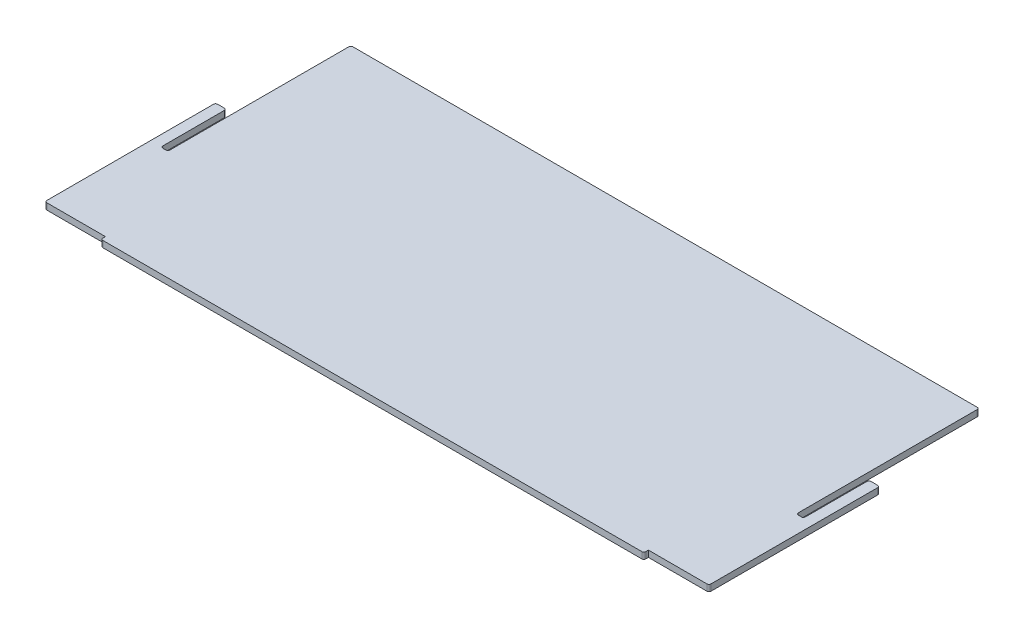
ISO-10303-21;
HEADER;
FILE_DESCRIPTION(('STEP AP214'),'2;1');
FILE_NAME('part.step','',(''),(''),'','','');
FILE_SCHEMA(('AUTOMOTIVE_DESIGN { 1 0 10303 214 1 1 1 1 }'));
ENDSEC;
DATA;
#1=APPLICATION_CONTEXT('core data for automotive mechanical design processes');
#2=APPLICATION_PROTOCOL_DEFINITION('international standard','automotive_design',2000,#1);
#3=PRODUCT_CONTEXT('',#1,'mechanical');
#4=PRODUCT('Part','Part','',(#3));
#5=PRODUCT_RELATED_PRODUCT_CATEGORY('part','',(#4));
#6=PRODUCT_DEFINITION_FORMATION('','',#4);
#7=PRODUCT_DEFINITION_CONTEXT('part definition',#1,'design');
#8=PRODUCT_DEFINITION('design','',#6,#7);
#9=PRODUCT_DEFINITION_SHAPE('','',#8);
#10=(LENGTH_UNIT() NAMED_UNIT(*) SI_UNIT(.MILLI.,.METRE.));
#11=(NAMED_UNIT(*) PLANE_ANGLE_UNIT() SI_UNIT($,.RADIAN.));
#12=(NAMED_UNIT(*) SI_UNIT($,.STERADIAN.) SOLID_ANGLE_UNIT());
#13=UNCERTAINTY_MEASURE_WITH_UNIT(LENGTH_MEASURE(1.E-05),#10,'distance_accuracy_value','');
#14=(GEOMETRIC_REPRESENTATION_CONTEXT(3) GLOBAL_UNCERTAINTY_ASSIGNED_CONTEXT((#13)) GLOBAL_UNIT_ASSIGNED_CONTEXT((#10,
#11,#12)) REPRESENTATION_CONTEXT('',''));
#15=CARTESIAN_POINT('',(0.,0.,0.));
#16=DIRECTION('',(0.,0.,1.));
#17=DIRECTION('',(1.,0.,0.));
#18=AXIS2_PLACEMENT_3D('',#15,#16,#17);
#19=CARTESIAN_POINT('',(313.36742,3.175,0.));
#20=DIRECTION('',(-1.,0.,0.));
#21=DIRECTION('',(0.,0.,1.));
#22=AXIS2_PLACEMENT_3D('',#19,#20,#21);
#23=PLANE('',#22);
#24=DIRECTION('',(0.,0.,-1.));
#25=VECTOR('',#24,1.);
#26=CARTESIAN_POINT('',(313.36742,0.,0.));
#27=LINE('',#26,#25);
#28=CARTESIAN_POINT('',(313.36742,0.,-53.4798358369533));
#29=VERTEX_POINT('',#28);
#30=CARTESIAN_POINT('',(313.36742,0.,-142.6878));
#31=VERTEX_POINT('',#30);
#32=EDGE_CURVE('E288',#29,#31,#27,.T.);
#33=ORIENTED_EDGE('',*,*,#32,.T.);
#34=DIRECTION('',(0.,-1.,0.));
#35=VECTOR('',#34,1.);
#36=CARTESIAN_POINT('',(313.36742,3.175,-142.6878));
#37=LINE('',#36,#35);
#38=CARTESIAN_POINT('',(313.36742,3.175,-142.6878));
#39=VERTEX_POINT('',#38);
#40=EDGE_CURVE('E50',#31,#39,#37,.F.);
#41=ORIENTED_EDGE('',*,*,#40,.T.);
#42=DIRECTION('',(0.,0.,-1.));
#43=VECTOR('',#42,1.);
#44=CARTESIAN_POINT('',(313.36742,3.175,0.));
#45=LINE('',#44,#43);
#46=CARTESIAN_POINT('',(313.36742,3.175,-53.4798358369533));
#47=VERTEX_POINT('',#46);
#48=EDGE_CURVE('E269',#47,#39,#45,.T.);
#49=ORIENTED_EDGE('',*,*,#48,.F.);
#50=DIRECTION('',(0.,1.,0.));
#51=VECTOR('',#50,1.);
#52=CARTESIAN_POINT('',(313.36742,3.175,-53.4798358369533));
#53=LINE('',#52,#51);
#54=EDGE_CURVE('E344',#47,#29,#53,.F.);
#55=ORIENTED_EDGE('',*,*,#54,.T.);
#56=EDGE_LOOP('',(#33,#41,#49,#55));
#57=FACE_BOUND('',#56,.T.);
#58=ADVANCED_FACE('F35',(#57),#23,.F.);
#59=CARTESIAN_POINT('',(0.,3.175,0.));
#60=DIRECTION('',(1.,0.,0.));
#61=DIRECTION('',(0.,0.,-1.));
#62=AXIS2_PLACEMENT_3D('',#59,#60,#61);
#63=PLANE('',#62);
#64=DIRECTION('',(0.,0.,1.));
#65=VECTOR('',#64,1.);
#66=CARTESIAN_POINT('',(0.,3.175,0.));
#67=LINE('',#66,#65);
#68=CARTESIAN_POINT('',(0.,3.175,-142.6878));
#69=VERTEX_POINT('',#68);
#70=CARTESIAN_POINT('',(0.,3.175,-53.4798358369533));
#71=VERTEX_POINT('',#70);
#72=EDGE_CURVE('E242',#69,#71,#67,.T.);
#73=ORIENTED_EDGE('',*,*,#72,.F.);
#74=DIRECTION('',(0.,-1.,0.));
#75=VECTOR('',#74,1.);
#76=CARTESIAN_POINT('',(0.,3.175,-142.6878));
#77=LINE('',#76,#75);
#78=CARTESIAN_POINT('',(0.,0.,-142.6878));
#79=VERTEX_POINT('',#78);
#80=EDGE_CURVE('E297',#69,#79,#77,.T.);
#81=ORIENTED_EDGE('',*,*,#80,.T.);
#82=DIRECTION('',(0.,0.,1.));
#83=VECTOR('',#82,1.);
#84=CARTESIAN_POINT('',(0.,0.,0.));
#85=LINE('',#84,#83);
#86=CARTESIAN_POINT('',(0.,0.,-53.4798358369533));
#87=VERTEX_POINT('',#86);
#88=EDGE_CURVE('E273',#79,#87,#85,.T.);
#89=ORIENTED_EDGE('',*,*,#88,.T.);
#90=DIRECTION('',(0.,1.,0.));
#91=VECTOR('',#90,1.);
#92=CARTESIAN_POINT('',(0.,3.175,-53.4798358369533));
#93=LINE('',#92,#91);
#94=EDGE_CURVE('E252',#87,#71,#93,.T.);
#95=ORIENTED_EDGE('',*,*,#94,.T.);
#96=EDGE_LOOP('',(#73,#81,#89,#95));
#97=FACE_BOUND('',#96,.T.);
#98=ADVANCED_FACE('F461',(#97),#63,.F.);
#99=CARTESIAN_POINT('',(0.,3.175,0.));
#100=DIRECTION('',(0.,0.,-1.));
#101=DIRECTION('',(-1.,0.,0.));
#102=AXIS2_PLACEMENT_3D('',#99,#100,#101);
#103=PLANE('',#102);
#104=DIRECTION('',(1.,0.,0.));
#105=VECTOR('',#104,1.);
#106=CARTESIAN_POINT('',(0.,3.175,0.));
#107=LINE('',#106,#105);
#108=CARTESIAN_POINT('',(-7.92671925771427,3.175,0.));
#109=VERTEX_POINT('',#108);
#110=CARTESIAN_POINT('',(21.2940899999997,3.175,0.));
#111=VERTEX_POINT('',#110);
#112=EDGE_CURVE('E231',#109,#111,#107,.T.);
#113=ORIENTED_EDGE('',*,*,#112,.F.);
#114=DIRECTION('',(0.,1.,0.));
#115=VECTOR('',#114,1.);
#116=CARTESIAN_POINT('',(-7.92671925771427,0.,0.));
#117=LINE('',#116,#115);
#118=CARTESIAN_POINT('',(-7.92671925771427,0.,0.));
#119=VERTEX_POINT('',#118);
#120=EDGE_CURVE('E384',#109,#119,#117,.F.);
#121=ORIENTED_EDGE('',*,*,#120,.T.);
#122=DIRECTION('',(1.,0.,0.));
#123=VECTOR('',#122,1.);
#124=CARTESIAN_POINT('',(0.,0.,0.));
#125=LINE('',#124,#123);
#126=CARTESIAN_POINT('',(21.2940899999997,0.,0.));
#127=VERTEX_POINT('',#126);
#128=EDGE_CURVE('E248',#119,#127,#125,.T.);
#129=ORIENTED_EDGE('',*,*,#128,.T.);
#130=DIRECTION('',(0.,-1.,0.));
#131=VECTOR('',#130,1.);
#132=CARTESIAN_POINT('',(21.2940899999997,3.175,0.));
#133=LINE('',#132,#131);
#134=EDGE_CURVE('E245',#111,#127,#133,.T.);
#135=ORIENTED_EDGE('',*,*,#134,.F.);
#136=EDGE_LOOP('',(#113,#121,#129,#135));
#137=FACE_BOUND('',#136,.T.);
#138=ADVANCED_FACE('F246',(#137),#103,.F.);
#139=CARTESIAN_POINT('',(21.2940899999997,3.175,2.286));
#140=DIRECTION('',(1.,0.,0.));
#141=DIRECTION('',(0.,0.,-1.));
#142=AXIS2_PLACEMENT_3D('',#139,#140,#141);
#143=PLANE('',#142);
#144=DIRECTION('',(0.,0.,1.));
#145=VECTOR('',#144,1.);
#146=CARTESIAN_POINT('',(21.2940899999997,0.,2.286));
#147=LINE('',#146,#145);
#148=CARTESIAN_POINT('',(21.2940899999997,0.,1.286));
#149=VERTEX_POINT('',#148);
#150=EDGE_CURVE('E278',#127,#149,#147,.T.);
#151=ORIENTED_EDGE('',*,*,#150,.T.);
#152=DIRECTION('',(0.,-1.,0.));
#153=VECTOR('',#152,1.);
#154=CARTESIAN_POINT('',(21.2940899999997,3.175,1.286));
#155=LINE('',#154,#153);
#156=CARTESIAN_POINT('',(21.2940899999997,3.175,1.286));
#157=VERTEX_POINT('',#156);
#158=EDGE_CURVE('E257',#149,#157,#155,.F.);
#159=ORIENTED_EDGE('',*,*,#158,.T.);
#160=DIRECTION('',(0.,0.,1.));
#161=VECTOR('',#160,1.);
#162=CARTESIAN_POINT('',(21.2940899999997,3.175,2.286));
#163=LINE('',#162,#161);
#164=EDGE_CURVE('E236',#111,#157,#163,.T.);
#165=ORIENTED_EDGE('',*,*,#164,.F.);
#166=ORIENTED_EDGE('',*,*,#134,.T.);
#167=EDGE_LOOP('',(#151,#159,#165,#166));
#168=FACE_BOUND('',#167,.T.);
#169=ADVANCED_FACE('F255',(#168),#143,.F.);
#170=CARTESIAN_POINT('',(21.2940899999997,3.175,2.286));
#171=DIRECTION('',(0.,0.,-1.));
#172=DIRECTION('',(-1.,0.,0.));
#173=AXIS2_PLACEMENT_3D('',#170,#171,#172);
#174=PLANE('',#173);
#175=DIRECTION('',(1.,0.,0.));
#176=VECTOR('',#175,1.);
#177=CARTESIAN_POINT('',(21.2940899999997,0.,2.286));
#178=LINE('',#177,#176);
#179=CARTESIAN_POINT('',(22.2940899999997,0.,2.286));
#180=VERTEX_POINT('',#179);
#181=CARTESIAN_POINT('',(291.07333,0.,2.28599999999998));
#182=VERTEX_POINT('',#181);
#183=EDGE_CURVE('E280',#180,#182,#178,.T.);
#184=ORIENTED_EDGE('',*,*,#183,.T.);
#185=DIRECTION('',(0.,-1.,0.));
#186=VECTOR('',#185,1.);
#187=CARTESIAN_POINT('',(291.07333,3.175,2.28599999999998));
#188=LINE('',#187,#186);
#189=CARTESIAN_POINT('',(291.07333,3.175,2.28599999999998));
#190=VERTEX_POINT('',#189);
#191=EDGE_CURVE('E376',#182,#190,#188,.F.);
#192=ORIENTED_EDGE('',*,*,#191,.T.);
#193=DIRECTION('',(1.,0.,0.));
#194=VECTOR('',#193,1.);
#195=CARTESIAN_POINT('',(21.2940899999997,3.175,2.286));
#196=LINE('',#195,#194);
#197=CARTESIAN_POINT('',(22.2940899999997,3.175,2.286));
#198=VERTEX_POINT('',#197);
#199=EDGE_CURVE('E258',#198,#190,#196,.T.);
#200=ORIENTED_EDGE('',*,*,#199,.F.);
#201=DIRECTION('',(0.,-1.,0.));
#202=VECTOR('',#201,1.);
#203=CARTESIAN_POINT('',(22.2940899999997,3.175,2.286));
#204=LINE('',#203,#202);
#205=EDGE_CURVE('E373',#198,#180,#204,.T.);
#206=ORIENTED_EDGE('',*,*,#205,.T.);
#207=EDGE_LOOP('',(#184,#192,#200,#206));
#208=FACE_BOUND('',#207,.T.);
#209=ADVANCED_FACE('F550',(#208),#174,.F.);
#210=CARTESIAN_POINT('',(292.07333,3.175,2.28599999999998));
#211=DIRECTION('',(-1.,0.,0.));
#212=DIRECTION('',(0.,0.,1.));
#213=AXIS2_PLACEMENT_3D('',#210,#211,#212);
#214=PLANE('',#213);
#215=DIRECTION('',(0.,0.,-1.));
#216=VECTOR('',#215,1.);
#217=CARTESIAN_POINT('',(292.07333,3.175,2.28599999999998));
#218=LINE('',#217,#216);
#219=CARTESIAN_POINT('',(292.07333,3.175,1.28599999999998));
#220=VERTEX_POINT('',#219);
#221=CARTESIAN_POINT('',(292.07333,3.175,0.));
#222=VERTEX_POINT('',#221);
#223=EDGE_CURVE('E261',#220,#222,#218,.T.);
#224=ORIENTED_EDGE('',*,*,#223,.F.);
#225=DIRECTION('',(0.,-1.,0.));
#226=VECTOR('',#225,1.);
#227=CARTESIAN_POINT('',(292.07333,3.175,1.28599999999998));
#228=LINE('',#227,#226);
#229=CARTESIAN_POINT('',(292.07333,0.,1.28599999999998));
#230=VERTEX_POINT('',#229);
#231=EDGE_CURVE('E370',#220,#230,#228,.T.);
#232=ORIENTED_EDGE('',*,*,#231,.T.);
#233=DIRECTION('',(0.,0.,-1.));
#234=VECTOR('',#233,1.);
#235=CARTESIAN_POINT('',(292.07333,0.,2.28599999999998));
#236=LINE('',#235,#234);
#237=CARTESIAN_POINT('',(292.07333,0.,0.));
#238=VERTEX_POINT('',#237);
#239=EDGE_CURVE('E283',#230,#238,#236,.T.);
#240=ORIENTED_EDGE('',*,*,#239,.T.);
#241=DIRECTION('',(0.,-1.,0.));
#242=VECTOR('',#241,1.);
#243=CARTESIAN_POINT('',(292.07333,3.175,0.));
#244=LINE('',#243,#242);
#245=EDGE_CURVE('E253',#222,#238,#244,.T.);
#246=ORIENTED_EDGE('',*,*,#245,.F.);
#247=EDGE_LOOP('',(#224,#232,#240,#246));
#248=FACE_BOUND('',#247,.T.);
#249=ADVANCED_FACE('F546',(#248),#214,.F.);
#250=CARTESIAN_POINT('',(292.07333,3.175,0.));
#251=DIRECTION('',(0.,0.,-1.));
#252=DIRECTION('',(-1.,0.,0.));
#253=AXIS2_PLACEMENT_3D('',#250,#251,#252);
#254=PLANE('',#253);
#255=DIRECTION('',(1.,0.,0.));
#256=VECTOR('',#255,1.);
#257=CARTESIAN_POINT('',(292.07333,0.,0.));
#258=LINE('',#257,#256);
#259=CARTESIAN_POINT('',(321.294139257714,0.,0.));
#260=VERTEX_POINT('',#259);
#261=EDGE_CURVE('E285',#238,#260,#258,.T.);
#262=ORIENTED_EDGE('',*,*,#261,.T.);
#263=DIRECTION('',(0.,1.,0.));
#264=VECTOR('',#263,1.);
#265=CARTESIAN_POINT('',(321.294139257714,3.175,0.));
#266=LINE('',#265,#264);
#267=CARTESIAN_POINT('',(321.294139257714,3.175,0.));
#268=VERTEX_POINT('',#267);
#269=EDGE_CURVE('E367',#260,#268,#266,.T.);
#270=ORIENTED_EDGE('',*,*,#269,.T.);
#271=DIRECTION('',(1.,0.,0.));
#272=VECTOR('',#271,1.);
#273=CARTESIAN_POINT('',(292.07333,3.175,0.));
#274=LINE('',#273,#272);
#275=EDGE_CURVE('E266',#222,#268,#274,.T.);
#276=ORIENTED_EDGE('',*,*,#275,.F.);
#277=ORIENTED_EDGE('',*,*,#245,.T.);
#278=EDGE_LOOP('',(#262,#270,#276,#277));
#279=FACE_BOUND('',#278,.T.);
#280=ADVANCED_FACE('F543',(#279),#254,.F.);
#281=CARTESIAN_POINT('',(0.,3.175,-143.6878));
#282=DIRECTION('',(0.,0.,1.));
#283=DIRECTION('',(1.,0.,0.));
#284=AXIS2_PLACEMENT_3D('',#281,#282,#283);
#285=PLANE('',#284);
#286=DIRECTION('',(-1.,0.,0.));
#287=VECTOR('',#286,1.);
#288=CARTESIAN_POINT('',(0.,0.,-143.6878));
#289=LINE('',#288,#287);
#290=CARTESIAN_POINT('',(312.36742,0.,-143.6878));
#291=VERTEX_POINT('',#290);
#292=CARTESIAN_POINT('',(1.,0.,-143.6878));
#293=VERTEX_POINT('',#292);
#294=EDGE_CURVE('E290',#291,#293,#289,.T.);
#295=ORIENTED_EDGE('',*,*,#294,.T.);
#296=DIRECTION('',(0.,-1.,0.));
#297=VECTOR('',#296,1.);
#298=CARTESIAN_POINT('',(1.,3.175,-143.6878));
#299=LINE('',#298,#297);
#300=CARTESIAN_POINT('',(1.,3.175,-143.6878));
#301=VERTEX_POINT('',#300);
#302=EDGE_CURVE('E323',#293,#301,#299,.F.);
#303=ORIENTED_EDGE('',*,*,#302,.T.);
#304=DIRECTION('',(-1.,0.,0.));
#305=VECTOR('',#304,1.);
#306=CARTESIAN_POINT('',(0.,3.175,-143.6878));
#307=LINE('',#306,#305);
#308=CARTESIAN_POINT('',(312.36742,3.175,-143.6878));
#309=VERTEX_POINT('',#308);
#310=EDGE_CURVE('E271',#309,#301,#307,.T.);
#311=ORIENTED_EDGE('',*,*,#310,.F.);
#312=DIRECTION('',(0.,-1.,0.));
#313=VECTOR('',#312,1.);
#314=CARTESIAN_POINT('',(312.36742,3.175,-143.6878));
#315=LINE('',#314,#313);
#316=EDGE_CURVE('E320',#309,#291,#315,.T.);
#317=ORIENTED_EDGE('',*,*,#316,.T.);
#318=EDGE_LOOP('',(#295,#303,#311,#317));
#319=FACE_BOUND('',#318,.T.);
#320=ADVANCED_FACE('F468',(#319),#285,.F.);
#321=CARTESIAN_POINT('',(0.,3.175,0.));
#322=DIRECTION('',(0.,-1.,0.));
#323=DIRECTION('',(0.,0.,-1.));
#324=AXIS2_PLACEMENT_3D('',#321,#322,#323);
#325=PLANE('',#324);
#326=ORIENTED_EDGE('',*,*,#310,.T.);
#327=CARTESIAN_POINT('',(1.,3.175,-142.6878));
#328=DIRECTION('',(0.,-1.,0.));
#329=DIRECTION('',(0.,0.,-1.));
#330=AXIS2_PLACEMENT_3D('',#327,#328,#329);
#331=CIRCLE('',#330,1.);
#332=EDGE_CURVE('E342',#301,#69,#331,.F.);
#333=ORIENTED_EDGE('',*,*,#332,.T.);
#334=ORIENTED_EDGE('',*,*,#72,.T.);
#335=CARTESIAN_POINT('',(-1.,3.175,-53.4798358369533));
#336=DIRECTION('',(0.,-1.,0.));
#337=DIRECTION('',(0.,0.,-1.));
#338=AXIS2_PLACEMENT_3D('',#335,#336,#337);
#339=CIRCLE('',#338,1.);
#340=CARTESIAN_POINT('',(-1.,3.175,-52.4798358369533));
#341=VERTEX_POINT('',#340);
#342=EDGE_CURVE('E408',#71,#341,#339,.T.);
#343=ORIENTED_EDGE('',*,*,#342,.T.);
#344=DIRECTION('',(-1.,0.,0.));
#345=VECTOR('',#344,1.);
#346=CARTESIAN_POINT('',(0.,3.175,-52.4798358369533));
#347=LINE('',#346,#345);
#348=CARTESIAN_POINT('',(-2.556,3.175,-52.4798358369533));
#349=VERTEX_POINT('',#348);
#350=EDGE_CURVE('E416',#341,#349,#347,.T.);
#351=ORIENTED_EDGE('',*,*,#350,.T.);
#352=CARTESIAN_POINT('',(-2.556,3.175,-53.4798358369533));
#353=DIRECTION('',(0.,-1.,0.));
#354=DIRECTION('',(0.,0.,-1.));
#355=AXIS2_PLACEMENT_3D('',#352,#353,#354);
#356=CIRCLE('',#355,1.);
#357=CARTESIAN_POINT('',(-3.556,3.175,-53.4798358369533));
#358=VERTEX_POINT('',#357);
#359=EDGE_CURVE('E43',#349,#358,#356,.T.);
#360=ORIENTED_EDGE('',*,*,#359,.T.);
#361=DIRECTION('',(0.,0.,-1.));
#362=VECTOR('',#361,1.);
#363=CARTESIAN_POINT('',(-3.556,3.175,-85.1529752379587));
#364=LINE('',#363,#362);
#365=CARTESIAN_POINT('',(-3.556,3.175,-84.1529752379587));
#366=VERTEX_POINT('',#365);
#367=EDGE_CURVE('E414',#358,#366,#364,.T.);
#368=ORIENTED_EDGE('',*,*,#367,.T.);
#369=CARTESIAN_POINT('',(-4.556,3.175,-84.1529752379587));
#370=DIRECTION('',(0.,-1.,0.));
#371=DIRECTION('',(0.,0.,-1.));
#372=AXIS2_PLACEMENT_3D('',#369,#370,#371);
#373=CIRCLE('',#372,1.);
#374=CARTESIAN_POINT('',(-4.556,3.175,-85.1529752379587));
#375=VERTEX_POINT('',#374);
#376=EDGE_CURVE('E327',#366,#375,#373,.F.);
#377=ORIENTED_EDGE('',*,*,#376,.T.);
#378=DIRECTION('',(-1.,0.,0.));
#379=VECTOR('',#378,1.);
#380=CARTESIAN_POINT('',(-8.92671925771427,3.175,-85.1529752379587));
#381=LINE('',#380,#379);
#382=CARTESIAN_POINT('',(-7.92671925771427,3.175,-85.1529752379587));
#383=VERTEX_POINT('',#382);
#384=EDGE_CURVE('E425',#375,#383,#381,.T.);
#385=ORIENTED_EDGE('',*,*,#384,.T.);
#386=CARTESIAN_POINT('',(-7.92671925771427,3.175,-84.1529752379587));
#387=DIRECTION('',(0.,-1.,0.));
#388=DIRECTION('',(0.,0.,-1.));
#389=AXIS2_PLACEMENT_3D('',#386,#387,#388);
#390=CIRCLE('',#389,1.);
#391=CARTESIAN_POINT('',(-8.92671925771427,3.175,-84.1529752379587));
#392=VERTEX_POINT('',#391);
#393=EDGE_CURVE('E325',#383,#392,#390,.F.);
#394=ORIENTED_EDGE('',*,*,#393,.T.);
#395=DIRECTION('',(0.,0.,1.));
#396=VECTOR('',#395,1.);
#397=CARTESIAN_POINT('',(-8.92671925771427,3.175,0.));
#398=LINE('',#397,#396);
#399=CARTESIAN_POINT('',(-8.92671925771427,3.175,-1.));
#400=VERTEX_POINT('',#399);
#401=EDGE_CURVE('E440',#392,#400,#398,.T.);
#402=ORIENTED_EDGE('',*,*,#401,.T.);
#403=CARTESIAN_POINT('',(-7.92671925771427,3.175,-1.));
#404=DIRECTION('',(0.,-1.,0.));
#405=DIRECTION('',(0.,0.,-1.));
#406=AXIS2_PLACEMENT_3D('',#403,#404,#405);
#407=CIRCLE('',#406,1.);
#408=EDGE_CURVE('E239',#400,#109,#407,.F.);
#409=ORIENTED_EDGE('',*,*,#408,.T.);
#410=ORIENTED_EDGE('',*,*,#112,.T.);
#411=ORIENTED_EDGE('',*,*,#164,.T.);
#412=CARTESIAN_POINT('',(22.2940899999997,3.175,1.286));
#413=DIRECTION('',(0.,-1.,0.));
#414=DIRECTION('',(0.,0.,-1.));
#415=AXIS2_PLACEMENT_3D('',#412,#413,#414);
#416=CIRCLE('',#415,1.);
#417=EDGE_CURVE('E330',#157,#198,#416,.F.);
#418=ORIENTED_EDGE('',*,*,#417,.T.);
#419=ORIENTED_EDGE('',*,*,#199,.T.);
#420=CARTESIAN_POINT('',(291.07333,3.175,1.28599999999998));
#421=DIRECTION('',(0.,-1.,0.));
#422=DIRECTION('',(0.,0.,-1.));
#423=AXIS2_PLACEMENT_3D('',#420,#421,#422);
#424=CIRCLE('',#423,1.);
#425=EDGE_CURVE('E332',#190,#220,#424,.F.);
#426=ORIENTED_EDGE('',*,*,#425,.T.);
#427=ORIENTED_EDGE('',*,*,#223,.T.);
#428=ORIENTED_EDGE('',*,*,#275,.T.);
#429=CARTESIAN_POINT('',(321.294139257714,3.175,-1.00000000000001));
#430=DIRECTION('',(0.,-1.,0.));
#431=DIRECTION('',(0.,0.,-1.));
#432=AXIS2_PLACEMENT_3D('',#429,#430,#431);
#433=CIRCLE('',#432,1.);
#434=CARTESIAN_POINT('',(322.294139257714,3.175,-1.00000000000001));
#435=VERTEX_POINT('',#434);
#436=EDGE_CURVE('E334',#268,#435,#433,.F.);
#437=ORIENTED_EDGE('',*,*,#436,.T.);
#438=DIRECTION('',(0.,0.,-1.));
#439=VECTOR('',#438,1.);
#440=CARTESIAN_POINT('',(322.294139257714,3.175,0.));
#441=LINE('',#440,#439);
#442=CARTESIAN_POINT('',(322.294139257714,3.175,-84.1529752379587));
#443=VERTEX_POINT('',#442);
#444=EDGE_CURVE('E494',#435,#443,#441,.T.);
#445=ORIENTED_EDGE('',*,*,#444,.T.);
#446=CARTESIAN_POINT('',(321.294139257714,3.175,-84.1529752379587));
#447=DIRECTION('',(0.,-1.,0.));
#448=DIRECTION('',(0.,0.,-1.));
#449=AXIS2_PLACEMENT_3D('',#446,#447,#448);
#450=CIRCLE('',#449,1.);
#451=CARTESIAN_POINT('',(321.294139257714,3.175,-85.1529752379587));
#452=VERTEX_POINT('',#451);
#453=EDGE_CURVE('E336',#443,#452,#450,.F.);
#454=ORIENTED_EDGE('',*,*,#453,.T.);
#455=DIRECTION('',(-1.,0.,0.));
#456=VECTOR('',#455,1.);
#457=CARTESIAN_POINT('',(322.294139257714,3.175,-85.1529752379587));
#458=LINE('',#457,#456);
#459=CARTESIAN_POINT('',(317.923419999999,3.175,-85.1529752379587));
#460=VERTEX_POINT('',#459);
#461=EDGE_CURVE('E497',#452,#460,#458,.T.);
#462=ORIENTED_EDGE('',*,*,#461,.T.);
#463=CARTESIAN_POINT('',(317.923419999999,3.175,-84.1529752379587));
#464=DIRECTION('',(0.,-1.,0.));
#465=DIRECTION('',(0.,0.,-1.));
#466=AXIS2_PLACEMENT_3D('',#463,#464,#465);
#467=CIRCLE('',#466,1.);
#468=CARTESIAN_POINT('',(316.923419999999,3.175,-84.1529752379587));
#469=VERTEX_POINT('',#468);
#470=EDGE_CURVE('E338',#460,#469,#467,.F.);
#471=ORIENTED_EDGE('',*,*,#470,.T.);
#472=DIRECTION('',(0.,0.,1.));
#473=VECTOR('',#472,1.);
#474=CARTESIAN_POINT('',(316.923419999999,3.175,-85.1529752379587));
#475=LINE('',#474,#473);
#476=CARTESIAN_POINT('',(316.923419999999,3.175,-53.4798358369533));
#477=VERTEX_POINT('',#476);
#478=EDGE_CURVE('E499',#469,#477,#475,.T.);
#479=ORIENTED_EDGE('',*,*,#478,.T.);
#480=CARTESIAN_POINT('',(315.923419999999,3.175,-53.4798358369533));
#481=DIRECTION('',(0.,-1.,0.));
#482=DIRECTION('',(0.,0.,-1.));
#483=AXIS2_PLACEMENT_3D('',#480,#481,#482);
#484=CIRCLE('',#483,1.);
#485=CARTESIAN_POINT('',(315.923419999999,3.175,-52.4798358369533));
#486=VERTEX_POINT('',#485);
#487=EDGE_CURVE('E401',#477,#486,#484,.T.);
#488=ORIENTED_EDGE('',*,*,#487,.T.);
#489=DIRECTION('',(-1.,0.,0.));
#490=VECTOR('',#489,1.);
#491=CARTESIAN_POINT('',(313.367419999999,3.175,-52.4798358369533));
#492=LINE('',#491,#490);
#493=CARTESIAN_POINT('',(314.36742,3.175,-52.4798358369533));
#494=VERTEX_POINT('',#493);
#495=EDGE_CURVE('E446',#486,#494,#492,.T.);
#496=ORIENTED_EDGE('',*,*,#495,.T.);
#497=CARTESIAN_POINT('',(314.36742,3.175,-53.4798358369533));
#498=DIRECTION('',(0.,-1.,0.));
#499=DIRECTION('',(0.,0.,-1.));
#500=AXIS2_PLACEMENT_3D('',#497,#498,#499);
#501=CIRCLE('',#500,1.);
#502=EDGE_CURVE('E57',#494,#47,#501,.T.);
#503=ORIENTED_EDGE('',*,*,#502,.T.);
#504=ORIENTED_EDGE('',*,*,#48,.T.);
#505=CARTESIAN_POINT('',(312.36742,3.175,-142.6878));
#506=DIRECTION('',(0.,-1.,0.));
#507=DIRECTION('',(0.,0.,-1.));
#508=AXIS2_PLACEMENT_3D('',#505,#506,#507);
#509=CIRCLE('',#508,1.);
#510=EDGE_CURVE('E340',#39,#309,#509,.F.);
#511=ORIENTED_EDGE('',*,*,#510,.T.);
#512=EDGE_LOOP('',(#326,#333,#334,#343,#351,#360,#368,#377,#385,#394,#402,#409,#410,#411,#418,
#419,#426,#427,#428,#437,#445,#454,#462,#471,#479,#488,#496,#503,#504,#511));
#513=FACE_BOUND('',#512,.T.);
#514=ADVANCED_FACE('F234',(#513),#325,.F.);
#515=CARTESIAN_POINT('',(0.,0.,0.));
#516=DIRECTION('',(0.,-1.,0.));
#517=DIRECTION('',(0.,0.,-1.));
#518=AXIS2_PLACEMENT_3D('',#515,#516,#517);
#519=PLANE('',#518);
#520=ORIENTED_EDGE('',*,*,#88,.F.);
#521=CARTESIAN_POINT('',(1.,0.,-142.6878));
#522=DIRECTION('',(0.,-1.,0.));
#523=DIRECTION('',(0.,0.,-1.));
#524=AXIS2_PLACEMENT_3D('',#521,#522,#523);
#525=CIRCLE('',#524,1.);
#526=EDGE_CURVE('E318',#79,#293,#525,.T.);
#527=ORIENTED_EDGE('',*,*,#526,.T.);
#528=ORIENTED_EDGE('',*,*,#294,.F.);
#529=CARTESIAN_POINT('',(312.36742,0.,-142.6878));
#530=DIRECTION('',(0.,-1.,0.));
#531=DIRECTION('',(0.,0.,-1.));
#532=AXIS2_PLACEMENT_3D('',#529,#530,#531);
#533=CIRCLE('',#532,1.);
#534=EDGE_CURVE('E316',#291,#31,#533,.T.);
#535=ORIENTED_EDGE('',*,*,#534,.T.);
#536=ORIENTED_EDGE('',*,*,#32,.F.);
#537=CARTESIAN_POINT('',(314.36742,0.,-53.4798358369533));
#538=DIRECTION('',(0.,-1.,0.));
#539=DIRECTION('',(0.,0.,-1.));
#540=AXIS2_PLACEMENT_3D('',#537,#538,#539);
#541=CIRCLE('',#540,1.);
#542=CARTESIAN_POINT('',(314.36742,0.,-52.4798358369533));
#543=VERTEX_POINT('',#542);
#544=EDGE_CURVE('E406',#29,#543,#541,.F.);
#545=ORIENTED_EDGE('',*,*,#544,.T.);
#546=DIRECTION('',(-1.,0.,0.));
#547=VECTOR('',#546,1.);
#548=CARTESIAN_POINT('',(313.367419999999,0.,-52.4798358369533));
#549=LINE('',#548,#547);
#550=CARTESIAN_POINT('',(315.923419999999,0.,-52.4798358369533));
#551=VERTEX_POINT('',#550);
#552=EDGE_CURVE('E453',#551,#543,#549,.T.);
#553=ORIENTED_EDGE('',*,*,#552,.F.);
#554=CARTESIAN_POINT('',(315.923419999999,0.,-53.4798358369533));
#555=DIRECTION('',(0.,-1.,0.));
#556=DIRECTION('',(0.,0.,-1.));
#557=AXIS2_PLACEMENT_3D('',#554,#555,#556);
#558=CIRCLE('',#557,1.);
#559=CARTESIAN_POINT('',(316.923419999999,0.,-53.4798358369533));
#560=VERTEX_POINT('',#559);
#561=EDGE_CURVE('E403',#551,#560,#558,.F.);
#562=ORIENTED_EDGE('',*,*,#561,.T.);
#563=DIRECTION('',(0.,0.,1.));
#564=VECTOR('',#563,1.);
#565=CARTESIAN_POINT('',(316.923419999999,0.,-85.1529752379587));
#566=LINE('',#565,#564);
#567=CARTESIAN_POINT('',(316.923419999999,0.,-84.1529752379587));
#568=VERTEX_POINT('',#567);
#569=EDGE_CURVE('E487',#568,#560,#566,.T.);
#570=ORIENTED_EDGE('',*,*,#569,.F.);
#571=CARTESIAN_POINT('',(317.923419999999,0.,-84.1529752379587));
#572=DIRECTION('',(0.,-1.,0.));
#573=DIRECTION('',(0.,0.,-1.));
#574=AXIS2_PLACEMENT_3D('',#571,#572,#573);
#575=CIRCLE('',#574,1.);
#576=CARTESIAN_POINT('',(317.923419999999,0.,-85.1529752379587));
#577=VERTEX_POINT('',#576);
#578=EDGE_CURVE('E314',#568,#577,#575,.T.);
#579=ORIENTED_EDGE('',*,*,#578,.T.);
#580=DIRECTION('',(-1.,0.,0.));
#581=VECTOR('',#580,1.);
#582=CARTESIAN_POINT('',(322.294139257714,0.,-85.1529752379587));
#583=LINE('',#582,#581);
#584=CARTESIAN_POINT('',(321.294139257714,0.,-85.1529752379587));
#585=VERTEX_POINT('',#584);
#586=EDGE_CURVE('E490',#585,#577,#583,.T.);
#587=ORIENTED_EDGE('',*,*,#586,.F.);
#588=CARTESIAN_POINT('',(321.294139257714,0.,-84.1529752379587));
#589=DIRECTION('',(0.,-1.,0.));
#590=DIRECTION('',(0.,0.,-1.));
#591=AXIS2_PLACEMENT_3D('',#588,#589,#590);
#592=CIRCLE('',#591,1.);
#593=CARTESIAN_POINT('',(322.294139257714,0.,-84.1529752379587));
#594=VERTEX_POINT('',#593);
#595=EDGE_CURVE('E312',#585,#594,#592,.T.);
#596=ORIENTED_EDGE('',*,*,#595,.T.);
#597=DIRECTION('',(0.,0.,-1.));
#598=VECTOR('',#597,1.);
#599=CARTESIAN_POINT('',(322.294139257714,0.,0.));
#600=LINE('',#599,#598);
#601=CARTESIAN_POINT('',(322.294139257714,0.,-1.00000000000001));
#602=VERTEX_POINT('',#601);
#603=EDGE_CURVE('E502',#602,#594,#600,.T.);
#604=ORIENTED_EDGE('',*,*,#603,.F.);
#605=CARTESIAN_POINT('',(321.294139257714,0.,-1.00000000000001));
#606=DIRECTION('',(0.,-1.,0.));
#607=DIRECTION('',(0.,0.,-1.));
#608=AXIS2_PLACEMENT_3D('',#605,#606,#607);
#609=CIRCLE('',#608,1.);
#610=EDGE_CURVE('E310',#602,#260,#609,.T.);
#611=ORIENTED_EDGE('',*,*,#610,.T.);
#612=ORIENTED_EDGE('',*,*,#261,.F.);
#613=ORIENTED_EDGE('',*,*,#239,.F.);
#614=CARTESIAN_POINT('',(291.07333,0.,1.28599999999998));
#615=DIRECTION('',(0.,-1.,0.));
#616=DIRECTION('',(0.,0.,-1.));
#617=AXIS2_PLACEMENT_3D('',#614,#615,#616);
#618=CIRCLE('',#617,1.);
#619=EDGE_CURVE('E308',#230,#182,#618,.T.);
#620=ORIENTED_EDGE('',*,*,#619,.T.);
#621=ORIENTED_EDGE('',*,*,#183,.F.);
#622=CARTESIAN_POINT('',(22.2940899999997,0.,1.286));
#623=DIRECTION('',(0.,-1.,0.));
#624=DIRECTION('',(0.,0.,-1.));
#625=AXIS2_PLACEMENT_3D('',#622,#623,#624);
#626=CIRCLE('',#625,1.);
#627=EDGE_CURVE('E306',#180,#149,#626,.T.);
#628=ORIENTED_EDGE('',*,*,#627,.T.);
#629=ORIENTED_EDGE('',*,*,#150,.F.);
#630=ORIENTED_EDGE('',*,*,#128,.F.);
#631=CARTESIAN_POINT('',(-7.92671925771427,0.,-1.));
#632=DIRECTION('',(0.,-1.,0.));
#633=DIRECTION('',(0.,0.,-1.));
#634=AXIS2_PLACEMENT_3D('',#631,#632,#633);
#635=CIRCLE('',#634,1.);
#636=CARTESIAN_POINT('',(-8.92671925771427,0.,-1.));
#637=VERTEX_POINT('',#636);
#638=EDGE_CURVE('E304',#119,#637,#635,.T.);
#639=ORIENTED_EDGE('',*,*,#638,.T.);
#640=DIRECTION('',(0.,0.,1.));
#641=VECTOR('',#640,1.);
#642=CARTESIAN_POINT('',(-8.92671925771427,0.,0.));
#643=LINE('',#642,#641);
#644=CARTESIAN_POINT('',(-8.92671925771427,0.,-84.1529752379587));
#645=VERTEX_POINT('',#644);
#646=EDGE_CURVE('E276',#645,#637,#643,.T.);
#647=ORIENTED_EDGE('',*,*,#646,.F.);
#648=CARTESIAN_POINT('',(-7.92671925771427,0.,-84.1529752379587));
#649=DIRECTION('',(0.,-1.,0.));
#650=DIRECTION('',(0.,0.,-1.));
#651=AXIS2_PLACEMENT_3D('',#648,#649,#650);
#652=CIRCLE('',#651,1.);
#653=CARTESIAN_POINT('',(-7.92671925771427,0.,-85.1529752379587));
#654=VERTEX_POINT('',#653);
#655=EDGE_CURVE('E300',#645,#654,#652,.T.);
#656=ORIENTED_EDGE('',*,*,#655,.T.);
#657=DIRECTION('',(-1.,0.,0.));
#658=VECTOR('',#657,1.);
#659=CARTESIAN_POINT('',(-8.92671925771427,0.,-85.1529752379587));
#660=LINE('',#659,#658);
#661=CARTESIAN_POINT('',(-4.556,0.,-85.1529752379587));
#662=VERTEX_POINT('',#661);
#663=EDGE_CURVE('E442',#662,#654,#660,.T.);
#664=ORIENTED_EDGE('',*,*,#663,.F.);
#665=CARTESIAN_POINT('',(-4.556,0.,-84.1529752379587));
#666=DIRECTION('',(0.,-1.,0.));
#667=DIRECTION('',(0.,0.,-1.));
#668=AXIS2_PLACEMENT_3D('',#665,#666,#667);
#669=CIRCLE('',#668,1.);
#670=CARTESIAN_POINT('',(-3.556,0.,-84.1529752379587));
#671=VERTEX_POINT('',#670);
#672=EDGE_CURVE('E302',#662,#671,#669,.T.);
#673=ORIENTED_EDGE('',*,*,#672,.T.);
#674=DIRECTION('',(0.,0.,-1.));
#675=VECTOR('',#674,1.);
#676=CARTESIAN_POINT('',(-3.556,0.,-85.1529752379587));
#677=LINE('',#676,#675);
#678=CARTESIAN_POINT('',(-3.556,0.,-53.4798358369533));
#679=VERTEX_POINT('',#678);
#680=EDGE_CURVE('E436',#679,#671,#677,.T.);
#681=ORIENTED_EDGE('',*,*,#680,.F.);
#682=CARTESIAN_POINT('',(-2.556,0.,-53.4798358369533));
#683=DIRECTION('',(0.,-1.,0.));
#684=DIRECTION('',(0.,0.,-1.));
#685=AXIS2_PLACEMENT_3D('',#682,#683,#684);
#686=CIRCLE('',#685,1.);
#687=CARTESIAN_POINT('',(-2.556,0.,-52.4798358369533));
#688=VERTEX_POINT('',#687);
#689=EDGE_CURVE('E11',#679,#688,#686,.F.);
#690=ORIENTED_EDGE('',*,*,#689,.T.);
#691=DIRECTION('',(-1.,0.,0.));
#692=VECTOR('',#691,1.);
#693=CARTESIAN_POINT('',(0.,0.,-52.4798358369533));
#694=LINE('',#693,#692);
#695=CARTESIAN_POINT('',(-1.,0.,-52.4798358369533));
#696=VERTEX_POINT('',#695);
#697=EDGE_CURVE('E434',#696,#688,#694,.T.);
#698=ORIENTED_EDGE('',*,*,#697,.F.);
#699=CARTESIAN_POINT('',(-1.,0.,-53.4798358369533));
#700=DIRECTION('',(0.,-1.,0.));
#701=DIRECTION('',(0.,0.,-1.));
#702=AXIS2_PLACEMENT_3D('',#699,#700,#701);
#703=CIRCLE('',#702,1.);
#704=EDGE_CURVE('E410',#696,#87,#703,.F.);
#705=ORIENTED_EDGE('',*,*,#704,.T.);
#706=EDGE_LOOP('',(#520,#527,#528,#535,#536,#545,#553,#562,#570,#579,#587,#596,#604,#611,#612,
#613,#620,#621,#628,#629,#630,#639,#647,#656,#664,#673,#681,#690,#698,#705));
#707=FACE_BOUND('',#706,.T.);
#708=ADVANCED_FACE('F433',(#707),#519,.T.);
#709=CARTESIAN_POINT('',(-8.92671925771427,0.,0.));
#710=DIRECTION('',(-1.,0.,0.));
#711=DIRECTION('',(0.,0.,1.));
#712=AXIS2_PLACEMENT_3D('',#709,#710,#711);
#713=PLANE('',#712);
#714=ORIENTED_EDGE('',*,*,#646,.T.);
#715=DIRECTION('',(0.,1.,0.));
#716=VECTOR('',#715,1.);
#717=CARTESIAN_POINT('',(-8.92671925771427,3.175,-1.));
#718=LINE('',#717,#716);
#719=EDGE_CURVE('E381',#637,#400,#718,.T.);
#720=ORIENTED_EDGE('',*,*,#719,.T.);
#721=ORIENTED_EDGE('',*,*,#401,.F.);
#722=DIRECTION('',(0.,1.,0.));
#723=VECTOR('',#722,1.);
#724=CARTESIAN_POINT('',(-8.92671925771427,0.,-84.1529752379587));
#725=LINE('',#724,#723);
#726=EDGE_CURVE('E379',#392,#645,#725,.F.);
#727=ORIENTED_EDGE('',*,*,#726,.T.);
#728=EDGE_LOOP('',(#714,#720,#721,#727));
#729=FACE_BOUND('',#728,.T.);
#730=ADVANCED_FACE('F571',(#729),#713,.T.);
#731=CARTESIAN_POINT('',(-8.92671925771427,0.,-85.1529752379587));
#732=DIRECTION('',(0.,0.,-1.));
#733=DIRECTION('',(-1.,0.,0.));
#734=AXIS2_PLACEMENT_3D('',#731,#732,#733);
#735=PLANE('',#734);
#736=ORIENTED_EDGE('',*,*,#384,.F.);
#737=DIRECTION('',(0.,1.,0.));
#738=VECTOR('',#737,1.);
#739=CARTESIAN_POINT('',(-4.556,0.,-85.1529752379587));
#740=LINE('',#739,#738);
#741=EDGE_CURVE('E399',#375,#662,#740,.F.);
#742=ORIENTED_EDGE('',*,*,#741,.T.);
#743=ORIENTED_EDGE('',*,*,#663,.T.);
#744=DIRECTION('',(0.,1.,0.));
#745=VECTOR('',#744,1.);
#746=CARTESIAN_POINT('',(-7.92671925771427,0.,-85.1529752379587));
#747=LINE('',#746,#745);
#748=EDGE_CURVE('E396',#654,#383,#747,.T.);
#749=ORIENTED_EDGE('',*,*,#748,.T.);
#750=EDGE_LOOP('',(#736,#742,#743,#749));
#751=FACE_BOUND('',#750,.T.);
#752=ADVANCED_FACE('F574',(#751),#735,.T.);
#753=CARTESIAN_POINT('',(-3.556,0.,-85.1529752379587));
#754=DIRECTION('',(1.,0.,0.));
#755=DIRECTION('',(0.,0.,-1.));
#756=AXIS2_PLACEMENT_3D('',#753,#754,#755);
#757=PLANE('',#756);
#758=ORIENTED_EDGE('',*,*,#367,.F.);
#759=DIRECTION('',(0.,1.,0.));
#760=VECTOR('',#759,1.);
#761=CARTESIAN_POINT('',(-3.556,0.,-53.4798358369533));
#762=LINE('',#761,#760);
#763=EDGE_CURVE('E394',#358,#679,#762,.F.);
#764=ORIENTED_EDGE('',*,*,#763,.T.);
#765=ORIENTED_EDGE('',*,*,#680,.T.);
#766=DIRECTION('',(0.,1.,0.));
#767=VECTOR('',#766,1.);
#768=CARTESIAN_POINT('',(-3.556,0.,-84.1529752379587));
#769=LINE('',#768,#767);
#770=EDGE_CURVE('E391',#671,#366,#769,.T.);
#771=ORIENTED_EDGE('',*,*,#770,.T.);
#772=EDGE_LOOP('',(#758,#764,#765,#771));
#773=FACE_BOUND('',#772,.T.);
#774=ADVANCED_FACE('F421',(#773),#757,.T.);
#775=CARTESIAN_POINT('',(0.,0.,-52.4798358369533));
#776=DIRECTION('',(0.,0.,-1.));
#777=DIRECTION('',(-1.,0.,0.));
#778=AXIS2_PLACEMENT_3D('',#775,#776,#777);
#779=PLANE('',#778);
#780=ORIENTED_EDGE('',*,*,#350,.F.);
#781=DIRECTION('',(0.,1.,0.));
#782=VECTOR('',#781,1.);
#783=CARTESIAN_POINT('',(-1.,0.,-52.4798358369533));
#784=LINE('',#783,#782);
#785=EDGE_CURVE('E389',#341,#696,#784,.F.);
#786=ORIENTED_EDGE('',*,*,#785,.T.);
#787=ORIENTED_EDGE('',*,*,#697,.T.);
#788=DIRECTION('',(0.,1.,0.));
#789=VECTOR('',#788,1.);
#790=CARTESIAN_POINT('',(-2.556,3.175,-52.4798358369533));
#791=LINE('',#790,#789);
#792=EDGE_CURVE('E386',#688,#349,#791,.T.);
#793=ORIENTED_EDGE('',*,*,#792,.T.);
#794=EDGE_LOOP('',(#780,#786,#787,#793));
#795=FACE_BOUND('',#794,.T.);
#796=ADVANCED_FACE('F438',(#795),#779,.T.);
#797=CARTESIAN_POINT('',(313.367419999999,0.,-52.4798358369533));
#798=DIRECTION('',(0.,0.,-1.));
#799=DIRECTION('',(-1.,0.,0.));
#800=AXIS2_PLACEMENT_3D('',#797,#798,#799);
#801=PLANE('',#800);
#802=ORIENTED_EDGE('',*,*,#495,.F.);
#803=DIRECTION('',(0.,1.,0.));
#804=VECTOR('',#803,1.);
#805=CARTESIAN_POINT('',(315.923419999999,0.,-52.4798358369533));
#806=LINE('',#805,#804);
#807=EDGE_CURVE('E355',#486,#551,#806,.F.);
#808=ORIENTED_EDGE('',*,*,#807,.T.);
#809=ORIENTED_EDGE('',*,*,#552,.T.);
#810=DIRECTION('',(0.,1.,0.));
#811=VECTOR('',#810,1.);
#812=CARTESIAN_POINT('',(314.36742,0.,-52.4798358369533));
#813=LINE('',#812,#811);
#814=EDGE_CURVE('E352',#543,#494,#813,.T.);
#815=ORIENTED_EDGE('',*,*,#814,.T.);
#816=EDGE_LOOP('',(#802,#808,#809,#815));
#817=FACE_BOUND('',#816,.T.);
#818=ADVANCED_FACE('F485',(#817),#801,.T.);
#819=CARTESIAN_POINT('',(316.923419999999,0.,-85.1529752379587));
#820=DIRECTION('',(-1.,0.,0.));
#821=DIRECTION('',(0.,0.,1.));
#822=AXIS2_PLACEMENT_3D('',#819,#820,#821);
#823=PLANE('',#822);
#824=ORIENTED_EDGE('',*,*,#569,.T.);
#825=DIRECTION('',(0.,1.,0.));
#826=VECTOR('',#825,1.);
#827=CARTESIAN_POINT('',(316.923419999999,3.175,-53.4798358369533));
#828=LINE('',#827,#826);
#829=EDGE_CURVE('E349',#560,#477,#828,.T.);
#830=ORIENTED_EDGE('',*,*,#829,.T.);
#831=ORIENTED_EDGE('',*,*,#478,.F.);
#832=DIRECTION('',(0.,1.,0.));
#833=VECTOR('',#832,1.);
#834=CARTESIAN_POINT('',(316.923419999999,0.,-84.1529752379587));
#835=LINE('',#834,#833);
#836=EDGE_CURVE('E347',#469,#568,#835,.F.);
#837=ORIENTED_EDGE('',*,*,#836,.T.);
#838=EDGE_LOOP('',(#824,#830,#831,#837));
#839=FACE_BOUND('',#838,.T.);
#840=ADVANCED_FACE('F521',(#839),#823,.T.);
#841=CARTESIAN_POINT('',(322.294139257714,0.,-85.1529752379587));
#842=DIRECTION('',(0.,0.,-1.));
#843=DIRECTION('',(-1.,0.,0.));
#844=AXIS2_PLACEMENT_3D('',#841,#842,#843);
#845=PLANE('',#844);
#846=ORIENTED_EDGE('',*,*,#586,.T.);
#847=DIRECTION('',(0.,1.,0.));
#848=VECTOR('',#847,1.);
#849=CARTESIAN_POINT('',(317.923419999999,0.,-85.1529752379587));
#850=LINE('',#849,#848);
#851=EDGE_CURVE('E359',#577,#460,#850,.T.);
#852=ORIENTED_EDGE('',*,*,#851,.T.);
#853=ORIENTED_EDGE('',*,*,#461,.F.);
#854=DIRECTION('',(0.,1.,0.));
#855=VECTOR('',#854,1.);
#856=CARTESIAN_POINT('',(321.294139257714,0.,-85.1529752379587));
#857=LINE('',#856,#855);
#858=EDGE_CURVE('E357',#452,#585,#857,.F.);
#859=ORIENTED_EDGE('',*,*,#858,.T.);
#860=EDGE_LOOP('',(#846,#852,#853,#859));
#861=FACE_BOUND('',#860,.T.);
#862=ADVANCED_FACE('F512',(#861),#845,.T.);
#863=CARTESIAN_POINT('',(322.294139257714,0.,0.));
#864=DIRECTION('',(1.,0.,0.));
#865=DIRECTION('',(0.,0.,-1.));
#866=AXIS2_PLACEMENT_3D('',#863,#864,#865);
#867=PLANE('',#866);
#868=ORIENTED_EDGE('',*,*,#603,.T.);
#869=DIRECTION('',(0.,1.,0.));
#870=VECTOR('',#869,1.);
#871=CARTESIAN_POINT('',(322.294139257714,0.,-84.1529752379587));
#872=LINE('',#871,#870);
#873=EDGE_CURVE('E364',#594,#443,#872,.T.);
#874=ORIENTED_EDGE('',*,*,#873,.T.);
#875=ORIENTED_EDGE('',*,*,#444,.F.);
#876=DIRECTION('',(0.,1.,0.));
#877=VECTOR('',#876,1.);
#878=CARTESIAN_POINT('',(322.294139257714,0.,-1.00000000000001));
#879=LINE('',#878,#877);
#880=EDGE_CURVE('E362',#435,#602,#879,.F.);
#881=ORIENTED_EDGE('',*,*,#880,.T.);
#882=EDGE_LOOP('',(#868,#874,#875,#881));
#883=FACE_BOUND('',#882,.T.);
#884=ADVANCED_FACE('F560',(#883),#867,.T.);
#885=CARTESIAN_POINT('',(1.,3.175,-142.6878));
#886=DIRECTION('',(0.,-1.,0.));
#887=DIRECTION('',(0.,0.,-1.));
#888=AXIS2_PLACEMENT_3D('',#885,#886,#887);
#889=CYLINDRICAL_SURFACE('',#888,1.);
#890=ORIENTED_EDGE('',*,*,#332,.F.);
#891=ORIENTED_EDGE('',*,*,#302,.F.);
#892=ORIENTED_EDGE('',*,*,#526,.F.);
#893=ORIENTED_EDGE('',*,*,#80,.F.);
#894=EDGE_LOOP('',(#890,#891,#892,#893));
#895=FACE_BOUND('',#894,.T.);
#896=ADVANCED_FACE('F464',(#895),#889,.T.);
#897=CARTESIAN_POINT('',(312.36742,3.175,-142.6878));
#898=DIRECTION('',(0.,-1.,0.));
#899=DIRECTION('',(0.,0.,-1.));
#900=AXIS2_PLACEMENT_3D('',#897,#898,#899);
#901=CYLINDRICAL_SURFACE('',#900,1.);
#902=ORIENTED_EDGE('',*,*,#510,.F.);
#903=ORIENTED_EDGE('',*,*,#40,.F.);
#904=ORIENTED_EDGE('',*,*,#534,.F.);
#905=ORIENTED_EDGE('',*,*,#316,.F.);
#906=EDGE_LOOP('',(#902,#903,#904,#905));
#907=FACE_BOUND('',#906,.T.);
#908=ADVANCED_FACE('F473',(#907),#901,.T.);
#909=CARTESIAN_POINT('',(315.923419999999,0.,-53.4798358369533));
#910=DIRECTION('',(0.,-1.,0.));
#911=DIRECTION('',(0.,0.,-1.));
#912=AXIS2_PLACEMENT_3D('',#909,#910,#911);
#913=CYLINDRICAL_SURFACE('',#912,1.);
#914=ORIENTED_EDGE('',*,*,#561,.F.);
#915=ORIENTED_EDGE('',*,*,#807,.F.);
#916=ORIENTED_EDGE('',*,*,#487,.F.);
#917=ORIENTED_EDGE('',*,*,#829,.F.);
#918=EDGE_LOOP('',(#914,#915,#916,#917));
#919=FACE_BOUND('',#918,.T.);
#920=ADVANCED_FACE('F525',(#919),#913,.F.);
#921=CARTESIAN_POINT('',(314.36742,0.,-53.4798358369533));
#922=DIRECTION('',(0.,1.,0.));
#923=DIRECTION('',(0.,0.,1.));
#924=AXIS2_PLACEMENT_3D('',#921,#922,#923);
#925=CYLINDRICAL_SURFACE('',#924,1.);
#926=ORIENTED_EDGE('',*,*,#544,.F.);
#927=ORIENTED_EDGE('',*,*,#54,.F.);
#928=ORIENTED_EDGE('',*,*,#502,.F.);
#929=ORIENTED_EDGE('',*,*,#814,.F.);
#930=EDGE_LOOP('',(#926,#927,#928,#929));
#931=FACE_BOUND('',#930,.T.);
#932=ADVANCED_FACE('F478',(#931),#925,.F.);
#933=CARTESIAN_POINT('',(317.923419999999,0.,-84.1529752379587));
#934=DIRECTION('',(0.,1.,0.));
#935=DIRECTION('',(0.,0.,1.));
#936=AXIS2_PLACEMENT_3D('',#933,#934,#935);
#937=CYLINDRICAL_SURFACE('',#936,1.);
#938=ORIENTED_EDGE('',*,*,#578,.F.);
#939=ORIENTED_EDGE('',*,*,#836,.F.);
#940=ORIENTED_EDGE('',*,*,#470,.F.);
#941=ORIENTED_EDGE('',*,*,#851,.F.);
#942=EDGE_LOOP('',(#938,#939,#940,#941));
#943=FACE_BOUND('',#942,.T.);
#944=ADVANCED_FACE('F518',(#943),#937,.T.);
#945=CARTESIAN_POINT('',(321.294139257714,0.,-84.1529752379587));
#946=DIRECTION('',(0.,1.,0.));
#947=DIRECTION('',(0.,0.,1.));
#948=AXIS2_PLACEMENT_3D('',#945,#946,#947);
#949=CYLINDRICAL_SURFACE('',#948,1.);
#950=ORIENTED_EDGE('',*,*,#595,.F.);
#951=ORIENTED_EDGE('',*,*,#858,.F.);
#952=ORIENTED_EDGE('',*,*,#453,.F.);
#953=ORIENTED_EDGE('',*,*,#873,.F.);
#954=EDGE_LOOP('',(#950,#951,#952,#953));
#955=FACE_BOUND('',#954,.T.);
#956=ADVANCED_FACE('F654',(#955),#949,.T.);
#957=CARTESIAN_POINT('',(321.294139257714,3.175,-1.00000000000001));
#958=DIRECTION('',(0.,-1.,0.));
#959=DIRECTION('',(0.,0.,-1.));
#960=AXIS2_PLACEMENT_3D('',#957,#958,#959);
#961=CYLINDRICAL_SURFACE('',#960,1.);
#962=ORIENTED_EDGE('',*,*,#610,.F.);
#963=ORIENTED_EDGE('',*,*,#880,.F.);
#964=ORIENTED_EDGE('',*,*,#436,.F.);
#965=ORIENTED_EDGE('',*,*,#269,.F.);
#966=EDGE_LOOP('',(#962,#963,#964,#965));
#967=FACE_BOUND('',#966,.T.);
#968=ADVANCED_FACE('F663',(#967),#961,.T.);
#969=CARTESIAN_POINT('',(291.07333,3.175,1.28599999999998));
#970=DIRECTION('',(0.,-1.,0.));
#971=DIRECTION('',(0.,0.,-1.));
#972=AXIS2_PLACEMENT_3D('',#969,#970,#971);
#973=CYLINDRICAL_SURFACE('',#972,1.);
#974=ORIENTED_EDGE('',*,*,#425,.F.);
#975=ORIENTED_EDGE('',*,*,#191,.F.);
#976=ORIENTED_EDGE('',*,*,#619,.F.);
#977=ORIENTED_EDGE('',*,*,#231,.F.);
#978=EDGE_LOOP('',(#974,#975,#976,#977));
#979=FACE_BOUND('',#978,.T.);
#980=ADVANCED_FACE('F673',(#979),#973,.T.);
#981=CARTESIAN_POINT('',(22.2940899999997,3.175,1.286));
#982=DIRECTION('',(0.,-1.,0.));
#983=DIRECTION('',(0.,0.,-1.));
#984=AXIS2_PLACEMENT_3D('',#981,#982,#983);
#985=CYLINDRICAL_SURFACE('',#984,1.);
#986=ORIENTED_EDGE('',*,*,#417,.F.);
#987=ORIENTED_EDGE('',*,*,#158,.F.);
#988=ORIENTED_EDGE('',*,*,#627,.F.);
#989=ORIENTED_EDGE('',*,*,#205,.F.);
#990=EDGE_LOOP('',(#986,#987,#988,#989));
#991=FACE_BOUND('',#990,.T.);
#992=ADVANCED_FACE('F683',(#991),#985,.T.);
#993=CARTESIAN_POINT('',(-7.92671925771427,0.,-1.));
#994=DIRECTION('',(0.,-1.,0.));
#995=DIRECTION('',(0.,0.,-1.));
#996=AXIS2_PLACEMENT_3D('',#993,#994,#995);
#997=CYLINDRICAL_SURFACE('',#996,1.);
#998=ORIENTED_EDGE('',*,*,#638,.F.);
#999=ORIENTED_EDGE('',*,*,#120,.F.);
#1000=ORIENTED_EDGE('',*,*,#408,.F.);
#1001=ORIENTED_EDGE('',*,*,#719,.F.);
#1002=EDGE_LOOP('',(#998,#999,#1000,#1001));
#1003=FACE_BOUND('',#1002,.T.);
#1004=ADVANCED_FACE('F693',(#1003),#997,.T.);
#1005=CARTESIAN_POINT('',(-1.,3.175,-53.4798358369533));
#1006=DIRECTION('',(0.,1.,0.));
#1007=DIRECTION('',(0.,0.,1.));
#1008=AXIS2_PLACEMENT_3D('',#1005,#1006,#1007);
#1009=CYLINDRICAL_SURFACE('',#1008,1.);
#1010=ORIENTED_EDGE('',*,*,#704,.F.);
#1011=ORIENTED_EDGE('',*,*,#785,.F.);
#1012=ORIENTED_EDGE('',*,*,#342,.F.);
#1013=ORIENTED_EDGE('',*,*,#94,.F.);
#1014=EDGE_LOOP('',(#1010,#1011,#1012,#1013));
#1015=FACE_BOUND('',#1014,.T.);
#1016=ADVANCED_FACE('F703',(#1015),#1009,.F.);
#1017=CARTESIAN_POINT('',(-2.556,0.,-53.4798358369533));
#1018=DIRECTION('',(0.,-1.,0.));
#1019=DIRECTION('',(0.,0.,-1.));
#1020=AXIS2_PLACEMENT_3D('',#1017,#1018,#1019);
#1021=CYLINDRICAL_SURFACE('',#1020,1.);
#1022=ORIENTED_EDGE('',*,*,#689,.F.);
#1023=ORIENTED_EDGE('',*,*,#763,.F.);
#1024=ORIENTED_EDGE('',*,*,#359,.F.);
#1025=ORIENTED_EDGE('',*,*,#792,.F.);
#1026=EDGE_LOOP('',(#1022,#1023,#1024,#1025));
#1027=FACE_BOUND('',#1026,.T.);
#1028=ADVANCED_FACE('F428',(#1027),#1021,.F.);
#1029=CARTESIAN_POINT('',(-4.556,0.,-84.1529752379587));
#1030=DIRECTION('',(0.,1.,0.));
#1031=DIRECTION('',(0.,0.,1.));
#1032=AXIS2_PLACEMENT_3D('',#1029,#1030,#1031);
#1033=CYLINDRICAL_SURFACE('',#1032,1.);
#1034=ORIENTED_EDGE('',*,*,#672,.F.);
#1035=ORIENTED_EDGE('',*,*,#741,.F.);
#1036=ORIENTED_EDGE('',*,*,#376,.F.);
#1037=ORIENTED_EDGE('',*,*,#770,.F.);
#1038=EDGE_LOOP('',(#1034,#1035,#1036,#1037));
#1039=FACE_BOUND('',#1038,.T.);
#1040=ADVANCED_FACE('F722',(#1039),#1033,.T.);
#1041=CARTESIAN_POINT('',(-7.92671925771427,0.,-84.1529752379587));
#1042=DIRECTION('',(0.,1.,0.));
#1043=DIRECTION('',(0.,0.,1.));
#1044=AXIS2_PLACEMENT_3D('',#1041,#1042,#1043);
#1045=CYLINDRICAL_SURFACE('',#1044,1.);
#1046=ORIENTED_EDGE('',*,*,#655,.F.);
#1047=ORIENTED_EDGE('',*,*,#726,.F.);
#1048=ORIENTED_EDGE('',*,*,#393,.F.);
#1049=ORIENTED_EDGE('',*,*,#748,.F.);
#1050=EDGE_LOOP('',(#1046,#1047,#1048,#1049));
#1051=FACE_BOUND('',#1050,.T.);
#1052=ADVANCED_FACE('F37',(#1051),#1045,.T.);
#1053=CLOSED_SHELL('',(#58,#98,#138,#169,#209,#249,#280,#320,#514,#708,#730,#752,#774,#796,#818,
#840,#862,#884,#896,#908,#920,#932,#944,#956,#968,#980,#992,#1004,#1016,#1028,#1040,#1052));
#1054=MANIFOLD_SOLID_BREP('B2',#1053);
#1055=ADVANCED_BREP_SHAPE_REPRESENTATION('',(#18,#1054),#14);
#1056=SHAPE_DEFINITION_REPRESENTATION(#9,#1055);
ENDSEC;
END-ISO-10303-21;
